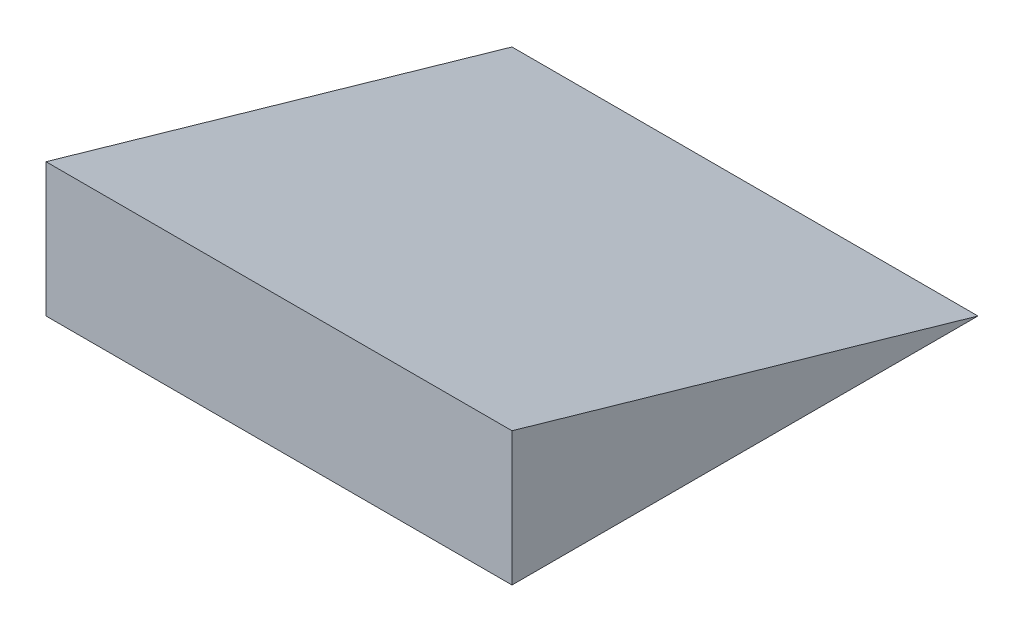
ISO-10303-21;
HEADER;
FILE_DESCRIPTION(('STEP AP214'),'2;1');
FILE_NAME('part.step','',(''),(''),'','','');
FILE_SCHEMA(('AUTOMOTIVE_DESIGN { 1 0 10303 214 1 1 1 1 }'));
ENDSEC;
DATA;
#1=APPLICATION_CONTEXT('core data for automotive mechanical design processes');
#2=APPLICATION_PROTOCOL_DEFINITION('international standard','automotive_design',2000,#1);
#3=PRODUCT_CONTEXT('',#1,'mechanical');
#4=PRODUCT('Part','Part','',(#3));
#5=PRODUCT_RELATED_PRODUCT_CATEGORY('part','',(#4));
#6=PRODUCT_DEFINITION_FORMATION('','',#4);
#7=PRODUCT_DEFINITION_CONTEXT('part definition',#1,'design');
#8=PRODUCT_DEFINITION('design','',#6,#7);
#9=PRODUCT_DEFINITION_SHAPE('','',#8);
#10=(LENGTH_UNIT() NAMED_UNIT(*) SI_UNIT(.MILLI.,.METRE.));
#11=(NAMED_UNIT(*) PLANE_ANGLE_UNIT() SI_UNIT($,.RADIAN.));
#12=(NAMED_UNIT(*) SI_UNIT($,.STERADIAN.) SOLID_ANGLE_UNIT());
#13=UNCERTAINTY_MEASURE_WITH_UNIT(LENGTH_MEASURE(1.E-05),#10,'distance_accuracy_value','');
#14=(GEOMETRIC_REPRESENTATION_CONTEXT(3) GLOBAL_UNCERTAINTY_ASSIGNED_CONTEXT((#13)) GLOBAL_UNIT_ASSIGNED_CONTEXT((#10,
#11,#12)) REPRESENTATION_CONTEXT('',''));
#15=CARTESIAN_POINT('',(0.,0.,0.));
#16=DIRECTION('',(0.,0.,1.));
#17=DIRECTION('',(1.,0.,0.));
#18=AXIS2_PLACEMENT_3D('',#15,#16,#17);
#19=CARTESIAN_POINT('',(100.,28.6745385758801,0.));
#20=DIRECTION('',(0.,0.,-1.));
#21=DIRECTION('',(0.,1.,0.));
#22=AXIS2_PLACEMENT_3D('',#19,#20,#21);
#23=PLANE('',#22);
#24=DIRECTION('',(0.,-1.,0.));
#25=VECTOR('',#24,1.);
#26=CARTESIAN_POINT('',(0.,28.6745385758801,0.));
#27=LINE('',#26,#25);
#28=CARTESIAN_POINT('',(0.,28.6745385758801,0.));
#29=VERTEX_POINT('',#28);
#30=CARTESIAN_POINT('',(0.,0.,0.));
#31=VERTEX_POINT('',#30);
#32=EDGE_CURVE('E89',#29,#31,#27,.T.);
#33=ORIENTED_EDGE('',*,*,#32,.T.);
#34=DIRECTION('',(-1.,0.,0.));
#35=VECTOR('',#34,1.);
#36=CARTESIAN_POINT('',(100.,0.,0.));
#37=LINE('',#36,#35);
#38=CARTESIAN_POINT('',(100.,0.,0.));
#39=VERTEX_POINT('',#38);
#40=EDGE_CURVE('E11',#39,#31,#37,.T.);
#41=ORIENTED_EDGE('',*,*,#40,.F.);
#42=DIRECTION('',(0.,-1.,0.));
#43=VECTOR('',#42,1.);
#44=CARTESIAN_POINT('',(100.,28.6745385758801,0.));
#45=LINE('',#44,#43);
#46=CARTESIAN_POINT('',(100.,28.6745385758801,0.));
#47=VERTEX_POINT('',#46);
#48=EDGE_CURVE('E81',#47,#39,#45,.T.);
#49=ORIENTED_EDGE('',*,*,#48,.F.);
#50=DIRECTION('',(-1.,0.,0.));
#51=VECTOR('',#50,1.);
#52=CARTESIAN_POINT('',(100.,28.6745385758801,0.));
#53=LINE('',#52,#51);
#54=EDGE_CURVE('E90',#47,#29,#53,.T.);
#55=ORIENTED_EDGE('',*,*,#54,.T.);
#56=EDGE_LOOP('',(#33,#41,#49,#55));
#57=FACE_BOUND('',#56,.T.);
#58=ADVANCED_FACE('F39',(#57),#23,.F.);
#59=CARTESIAN_POINT('',(100.,0.,0.));
#60=DIRECTION('',(0.,1.,0.));
#61=DIRECTION('',(0.,0.,1.));
#62=AXIS2_PLACEMENT_3D('',#59,#60,#61);
#63=PLANE('',#62);
#64=DIRECTION('',(0.,0.,-1.));
#65=VECTOR('',#64,1.);
#66=CARTESIAN_POINT('',(0.,0.,0.));
#67=LINE('',#66,#65);
#68=CARTESIAN_POINT('',(0.,0.,-100.));
#69=VERTEX_POINT('',#68);
#70=EDGE_CURVE('E68',#31,#69,#67,.T.);
#71=ORIENTED_EDGE('',*,*,#70,.T.);
#72=DIRECTION('',(-1.,0.,0.));
#73=VECTOR('',#72,1.);
#74=CARTESIAN_POINT('',(100.,0.,-100.));
#75=LINE('',#74,#73);
#76=CARTESIAN_POINT('',(100.,0.,-100.));
#77=VERTEX_POINT('',#76);
#78=EDGE_CURVE('E48',#77,#69,#75,.T.);
#79=ORIENTED_EDGE('',*,*,#78,.F.);
#80=DIRECTION('',(0.,0.,-1.));
#81=VECTOR('',#80,1.);
#82=CARTESIAN_POINT('',(100.,0.,0.));
#83=LINE('',#82,#81);
#84=EDGE_CURVE('E76',#39,#77,#83,.T.);
#85=ORIENTED_EDGE('',*,*,#84,.F.);
#86=ORIENTED_EDGE('',*,*,#40,.T.);
#87=EDGE_LOOP('',(#71,#79,#85,#86));
#88=FACE_BOUND('',#87,.T.);
#89=ADVANCED_FACE('F77',(#88),#63,.F.);
#90=CARTESIAN_POINT('',(100.,0.,-100.));
#91=DIRECTION('',(0.,-0.961261695938321,0.275637355816993));
#92=DIRECTION('',(0.,-0.275637355816993,-0.961261695938321));
#93=AXIS2_PLACEMENT_3D('',#90,#91,#92);
#94=PLANE('',#93);
#95=DIRECTION('',(0.,0.275637355816993,0.961261695938321));
#96=VECTOR('',#95,1.);
#97=CARTESIAN_POINT('',(0.,0.,-100.));
#98=LINE('',#97,#96);
#99=EDGE_CURVE('E73',#69,#29,#98,.T.);
#100=ORIENTED_EDGE('',*,*,#99,.T.);
#101=ORIENTED_EDGE('',*,*,#54,.F.);
#102=DIRECTION('',(0.,0.275637355816993,0.961261695938321));
#103=VECTOR('',#102,1.);
#104=CARTESIAN_POINT('',(100.,0.,-100.));
#105=LINE('',#104,#103);
#106=EDGE_CURVE('E56',#77,#47,#105,.T.);
#107=ORIENTED_EDGE('',*,*,#106,.F.);
#108=ORIENTED_EDGE('',*,*,#78,.T.);
#109=EDGE_LOOP('',(#100,#101,#107,#108));
#110=FACE_BOUND('',#109,.T.);
#111=ADVANCED_FACE('F102',(#110),#94,.F.);
#112=CARTESIAN_POINT('',(100.,0.,0.));
#113=DIRECTION('',(1.,0.,0.));
#114=DIRECTION('',(0.,0.,-1.));
#115=AXIS2_PLACEMENT_3D('',#112,#113,#114);
#116=PLANE('',#115);
#117=ORIENTED_EDGE('',*,*,#48,.T.);
#118=ORIENTED_EDGE('',*,*,#84,.T.);
#119=ORIENTED_EDGE('',*,*,#106,.T.);
#120=EDGE_LOOP('',(#117,#118,#119));
#121=FACE_BOUND('',#120,.T.);
#122=ADVANCED_FACE('F84',(#121),#116,.T.);
#123=CARTESIAN_POINT('',(0.,0.,0.));
#124=DIRECTION('',(1.,0.,0.));
#125=DIRECTION('',(0.,0.,-1.));
#126=AXIS2_PLACEMENT_3D('',#123,#124,#125);
#127=PLANE('',#126);
#128=ORIENTED_EDGE('',*,*,#32,.F.);
#129=ORIENTED_EDGE('',*,*,#99,.F.);
#130=ORIENTED_EDGE('',*,*,#70,.F.);
#131=EDGE_LOOP('',(#128,#129,#130));
#132=FACE_BOUND('',#131,.T.);
#133=ADVANCED_FACE('F103',(#132),#127,.F.);
#134=CLOSED_SHELL('',(#58,#89,#111,#122,#133));
#135=MANIFOLD_SOLID_BREP('B2',#134);
#136=ADVANCED_BREP_SHAPE_REPRESENTATION('',(#18,#135),#14);
#137=SHAPE_DEFINITION_REPRESENTATION(#9,#136);
ENDSEC;
END-ISO-10303-21;
